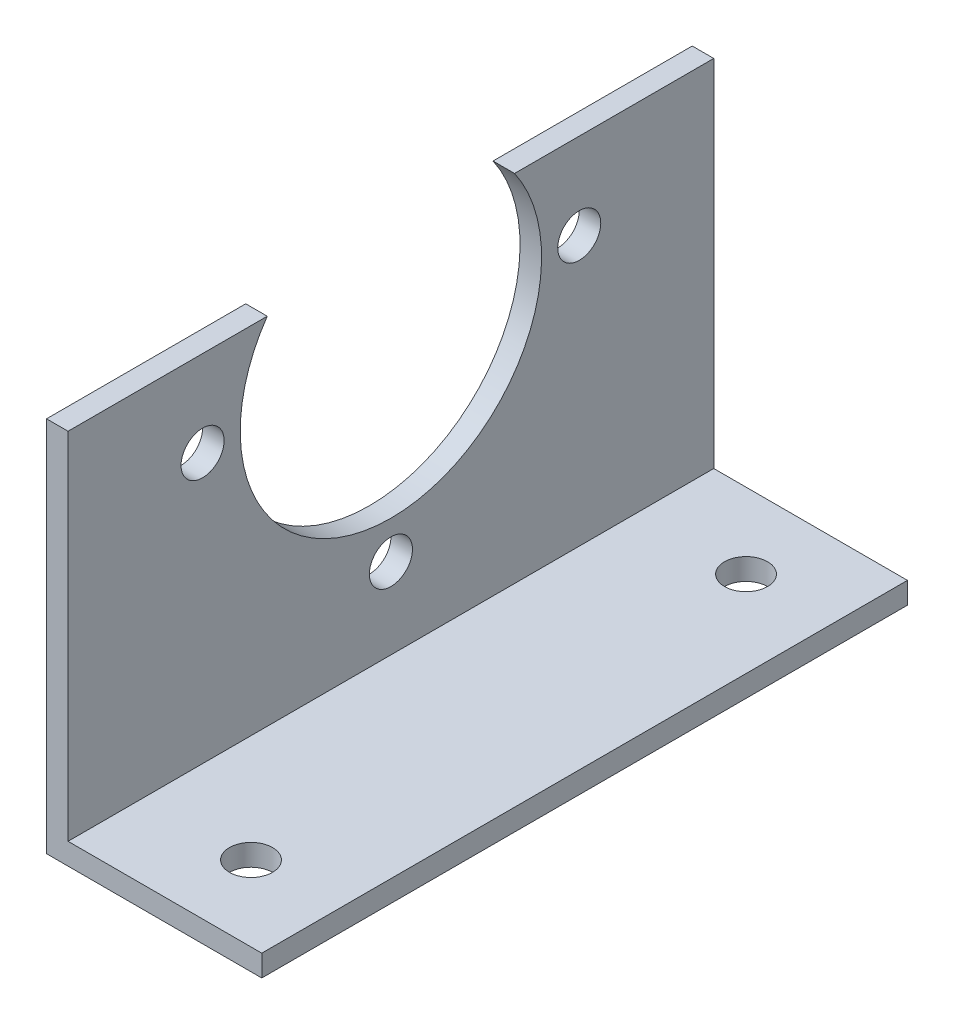
ISO-10303-21;
HEADER;
FILE_DESCRIPTION(('STEP AP214'),'2;1');
FILE_NAME('part.step','',(''),(''),'','','');
FILE_SCHEMA(('AUTOMOTIVE_DESIGN { 1 0 10303 214 1 1 1 1 }'));
ENDSEC;
DATA;
#1=APPLICATION_CONTEXT('core data for automotive mechanical design processes');
#2=APPLICATION_PROTOCOL_DEFINITION('international standard','automotive_design',2000,#1);
#3=PRODUCT_CONTEXT('',#1,'mechanical');
#4=PRODUCT('Part','Part','',(#3));
#5=PRODUCT_RELATED_PRODUCT_CATEGORY('part','',(#4));
#6=PRODUCT_DEFINITION_FORMATION('','',#4);
#7=PRODUCT_DEFINITION_CONTEXT('part definition',#1,'design');
#8=PRODUCT_DEFINITION('design','',#6,#7);
#9=PRODUCT_DEFINITION_SHAPE('','',#8);
#10=(LENGTH_UNIT() NAMED_UNIT(*) SI_UNIT(.MILLI.,.METRE.));
#11=(NAMED_UNIT(*) PLANE_ANGLE_UNIT() SI_UNIT($,.RADIAN.));
#12=(NAMED_UNIT(*) SI_UNIT($,.STERADIAN.) SOLID_ANGLE_UNIT());
#13=UNCERTAINTY_MEASURE_WITH_UNIT(LENGTH_MEASURE(1.E-05),#10,'distance_accuracy_value','');
#14=(GEOMETRIC_REPRESENTATION_CONTEXT(3) GLOBAL_UNCERTAINTY_ASSIGNED_CONTEXT((#13)) GLOBAL_UNIT_ASSIGNED_CONTEXT((#10,
#11,#12)) REPRESENTATION_CONTEXT('',''));
#15=CARTESIAN_POINT('',(0.,0.,0.));
#16=DIRECTION('',(0.,0.,1.));
#17=DIRECTION('',(1.,0.,0.));
#18=AXIS2_PLACEMENT_3D('',#15,#16,#17);
#19=CARTESIAN_POINT('',(0.,35.,-60.));
#20=DIRECTION('',(0.,-1.,0.));
#21=DIRECTION('',(0.,0.,1.));
#22=AXIS2_PLACEMENT_3D('',#19,#20,#21);
#23=PLANE('',#22);
#24=DIRECTION('',(0.,0.,1.));
#25=VECTOR('',#24,1.);
#26=CARTESIAN_POINT('',(2.,35.,-60.));
#27=LINE('',#26,#25);
#28=CARTESIAN_POINT('',(2.,35.,-60.));
#29=VERTEX_POINT('',#28);
#30=CARTESIAN_POINT('',(2.,35.,-41.4891252930761));
#31=VERTEX_POINT('',#30);
#32=EDGE_CURVE('E158',#29,#31,#27,.T.);
#33=ORIENTED_EDGE('',*,*,#32,.F.);
#34=DIRECTION('',(-1.,0.,0.));
#35=VECTOR('',#34,1.);
#36=CARTESIAN_POINT('',(0.,35.,-60.));
#37=LINE('',#36,#35);
#38=CARTESIAN_POINT('',(0.,35.,-60.));
#39=VERTEX_POINT('',#38);
#40=EDGE_CURVE('E137',#29,#39,#37,.T.);
#41=ORIENTED_EDGE('',*,*,#40,.T.);
#42=DIRECTION('',(0.,0.,1.));
#43=VECTOR('',#42,1.);
#44=CARTESIAN_POINT('',(0.,35.,-60.));
#45=LINE('',#44,#43);
#46=CARTESIAN_POINT('',(0.,35.,-41.4891252930761));
#47=VERTEX_POINT('',#46);
#48=EDGE_CURVE('E154',#39,#47,#45,.T.);
#49=ORIENTED_EDGE('',*,*,#48,.T.);
#50=DIRECTION('',(-1.,0.,0.));
#51=VECTOR('',#50,1.);
#52=CARTESIAN_POINT('',(10.,35.,-41.4891252930761));
#53=LINE('',#52,#51);
#54=EDGE_CURVE('E192',#31,#47,#53,.T.);
#55=ORIENTED_EDGE('',*,*,#54,.F.);
#56=EDGE_LOOP('',(#33,#41,#49,#55));
#57=FACE_BOUND('',#56,.T.);
#58=ADVANCED_FACE('F43',(#57),#23,.F.);
#59=CARTESIAN_POINT('',(35.,0.,-60.));
#60=DIRECTION('',(0.,1.,0.));
#61=DIRECTION('',(-1.,0.,0.));
#62=AXIS2_PLACEMENT_3D('',#59,#60,#61);
#63=PLANE('',#62);
#64=CARTESIAN_POINT('',(12.,0.,-53.));
#65=DIRECTION('',(0.,1.,0.));
#66=DIRECTION('',(1.,0.,0.));
#67=AXIS2_PLACEMENT_3D('',#64,#65,#66);
#68=CIRCLE('',#67,2.);
#69=CARTESIAN_POINT('',(14.,0.,-53.));
#70=VERTEX_POINT('',#69);
#71=EDGE_CURVE('E166',#70,#70,#68,.T.);
#72=ORIENTED_EDGE('',*,*,#71,.T.);
#73=EDGE_LOOP('',(#72));
#74=FACE_BOUND('',#73,.T.);
#75=CARTESIAN_POINT('',(12.,0.,-7.));
#76=DIRECTION('',(0.,1.,0.));
#77=DIRECTION('',(1.,0.,0.));
#78=AXIS2_PLACEMENT_3D('',#75,#76,#77);
#79=CIRCLE('',#78,2.);
#80=CARTESIAN_POINT('',(14.,0.,-7.));
#81=VERTEX_POINT('',#80);
#82=EDGE_CURVE('E171',#81,#81,#79,.T.);
#83=ORIENTED_EDGE('',*,*,#82,.T.);
#84=EDGE_LOOP('',(#83));
#85=FACE_BOUND('',#84,.T.);
#86=DIRECTION('',(1.,0.,0.));
#87=VECTOR('',#86,1.);
#88=CARTESIAN_POINT('',(35.,0.,0.));
#89=LINE('',#88,#87);
#90=CARTESIAN_POINT('',(0.,0.,0.));
#91=VERTEX_POINT('',#90);
#92=CARTESIAN_POINT('',(20.,0.,0.));
#93=VERTEX_POINT('',#92);
#94=EDGE_CURVE('E142',#91,#93,#89,.T.);
#95=ORIENTED_EDGE('',*,*,#94,.F.);
#96=DIRECTION('',(0.,0.,1.));
#97=VECTOR('',#96,1.);
#98=CARTESIAN_POINT('',(0.,0.,-60.));
#99=LINE('',#98,#97);
#100=CARTESIAN_POINT('',(0.,0.,-60.));
#101=VERTEX_POINT('',#100);
#102=EDGE_CURVE('E125',#101,#91,#99,.T.);
#103=ORIENTED_EDGE('',*,*,#102,.F.);
#104=DIRECTION('',(1.,0.,0.));
#105=VECTOR('',#104,1.);
#106=CARTESIAN_POINT('',(35.,0.,-60.));
#107=LINE('',#106,#105);
#108=CARTESIAN_POINT('',(20.,0.,-60.));
#109=VERTEX_POINT('',#108);
#110=EDGE_CURVE('E111',#101,#109,#107,.T.);
#111=ORIENTED_EDGE('',*,*,#110,.T.);
#112=DIRECTION('',(0.,0.,1.));
#113=VECTOR('',#112,1.);
#114=CARTESIAN_POINT('',(20.,0.,-60.));
#115=LINE('',#114,#113);
#116=EDGE_CURVE('E117',#109,#93,#115,.T.);
#117=ORIENTED_EDGE('',*,*,#116,.T.);
#118=EDGE_LOOP('',(#95,#103,#111,#117));
#119=FACE_BOUND('',#118,.T.);
#120=ADVANCED_FACE('F45',(#74,#85,#119),#63,.F.);
#121=CARTESIAN_POINT('',(2.,2.,-60.));
#122=DIRECTION('',(0.,-1.,0.));
#123=DIRECTION('',(1.,0.,0.));
#124=AXIS2_PLACEMENT_3D('',#121,#122,#123);
#125=PLANE('',#124);
#126=CARTESIAN_POINT('',(12.,2.,-53.));
#127=DIRECTION('',(0.,1.,0.));
#128=DIRECTION('',(1.,0.,0.));
#129=AXIS2_PLACEMENT_3D('',#126,#127,#128);
#130=CIRCLE('',#129,2.);
#131=CARTESIAN_POINT('',(14.,2.,-53.));
#132=VERTEX_POINT('',#131);
#133=EDGE_CURVE('E47',#132,#132,#130,.T.);
#134=ORIENTED_EDGE('',*,*,#133,.F.);
#135=EDGE_LOOP('',(#134));
#136=FACE_BOUND('',#135,.T.);
#137=CARTESIAN_POINT('',(12.,2.,-7.));
#138=DIRECTION('',(0.,1.,0.));
#139=DIRECTION('',(1.,0.,0.));
#140=AXIS2_PLACEMENT_3D('',#137,#138,#139);
#141=CIRCLE('',#140,2.);
#142=CARTESIAN_POINT('',(14.,2.,-7.));
#143=VERTEX_POINT('',#142);
#144=EDGE_CURVE('E164',#143,#143,#141,.T.);
#145=ORIENTED_EDGE('',*,*,#144,.F.);
#146=EDGE_LOOP('',(#145));
#147=FACE_BOUND('',#146,.T.);
#148=DIRECTION('',(-1.,0.,0.));
#149=VECTOR('',#148,1.);
#150=CARTESIAN_POINT('',(2.,2.,-60.));
#151=LINE('',#150,#149);
#152=CARTESIAN_POINT('',(20.,2.,-60.));
#153=VERTEX_POINT('',#152);
#154=CARTESIAN_POINT('',(2.,2.,-60.));
#155=VERTEX_POINT('',#154);
#156=EDGE_CURVE('E114',#153,#155,#151,.T.);
#157=ORIENTED_EDGE('',*,*,#156,.T.);
#158=DIRECTION('',(0.,0.,1.));
#159=VECTOR('',#158,1.);
#160=CARTESIAN_POINT('',(2.,2.,-60.));
#161=LINE('',#160,#159);
#162=CARTESIAN_POINT('',(2.,2.,0.));
#163=VERTEX_POINT('',#162);
#164=EDGE_CURVE('E161',#155,#163,#161,.T.);
#165=ORIENTED_EDGE('',*,*,#164,.T.);
#166=DIRECTION('',(-1.,0.,0.));
#167=VECTOR('',#166,1.);
#168=CARTESIAN_POINT('',(2.,2.,0.));
#169=LINE('',#168,#167);
#170=CARTESIAN_POINT('',(20.,2.,0.));
#171=VERTEX_POINT('',#170);
#172=EDGE_CURVE('E144',#171,#163,#169,.T.);
#173=ORIENTED_EDGE('',*,*,#172,.F.);
#174=DIRECTION('',(0.,0.,1.));
#175=VECTOR('',#174,1.);
#176=CARTESIAN_POINT('',(20.,2.,-60.));
#177=LINE('',#176,#175);
#178=EDGE_CURVE('E116',#153,#171,#177,.T.);
#179=ORIENTED_EDGE('',*,*,#178,.F.);
#180=EDGE_LOOP('',(#157,#165,#173,#179));
#181=FACE_BOUND('',#180,.T.);
#182=ADVANCED_FACE('F209',(#136,#147,#181),#125,.F.);
#183=CARTESIAN_POINT('',(2.,35.,-60.));
#184=DIRECTION('',(-1.,0.,0.));
#185=DIRECTION('',(0.,-1.,0.));
#186=AXIS2_PLACEMENT_3D('',#183,#184,#185);
#187=PLANE('',#186);
#188=CARTESIAN_POINT('',(2.,27.,-12.5));
#189=DIRECTION('',(1.,0.,0.));
#190=DIRECTION('',(0.,-1.,0.));
#191=AXIS2_PLACEMENT_3D('',#188,#189,#190);
#192=CIRCLE('',#191,2.);
#193=CARTESIAN_POINT('',(2.,25.,-12.5));
#194=VERTEX_POINT('',#193);
#195=EDGE_CURVE('E133',#194,#194,#192,.T.);
#196=ORIENTED_EDGE('',*,*,#195,.F.);
#197=EDGE_LOOP('',(#196));
#198=FACE_BOUND('',#197,.T.);
#199=CARTESIAN_POINT('',(2.,27.,-47.5));
#200=DIRECTION('',(1.,0.,0.));
#201=DIRECTION('',(0.,-1.,0.));
#202=AXIS2_PLACEMENT_3D('',#199,#200,#201);
#203=CIRCLE('',#202,2.);
#204=CARTESIAN_POINT('',(2.,25.,-47.5));
#205=VERTEX_POINT('',#204);
#206=EDGE_CURVE('E196',#205,#205,#203,.T.);
#207=ORIENTED_EDGE('',*,*,#206,.F.);
#208=EDGE_LOOP('',(#207));
#209=FACE_BOUND('',#208,.T.);
#210=CARTESIAN_POINT('',(2.,9.5,-30.));
#211=DIRECTION('',(1.,0.,0.));
#212=DIRECTION('',(0.,-1.,0.));
#213=AXIS2_PLACEMENT_3D('',#210,#211,#212);
#214=CIRCLE('',#213,2.);
#215=CARTESIAN_POINT('',(2.,7.5,-30.));
#216=VERTEX_POINT('',#215);
#217=EDGE_CURVE('E194',#216,#216,#214,.T.);
#218=ORIENTED_EDGE('',*,*,#217,.F.);
#219=EDGE_LOOP('',(#218));
#220=FACE_BOUND('',#219,.T.);
#221=CARTESIAN_POINT('',(2.,35.,-18.5108747069239));
#222=VERTEX_POINT('',#221);
#223=CARTESIAN_POINT('',(2.,35.,0.));
#224=VERTEX_POINT('',#223);
#225=EDGE_CURVE('E157',#222,#224,#27,.T.);
#226=ORIENTED_EDGE('',*,*,#225,.T.);
#227=DIRECTION('',(0.,1.,0.));
#228=VECTOR('',#227,1.);
#229=CARTESIAN_POINT('',(2.,35.,0.));
#230=LINE('',#229,#228);
#231=EDGE_CURVE('E147',#163,#224,#230,.T.);
#232=ORIENTED_EDGE('',*,*,#231,.F.);
#233=ORIENTED_EDGE('',*,*,#164,.F.);
#234=DIRECTION('',(0.,1.,0.));
#235=VECTOR('',#234,1.);
#236=CARTESIAN_POINT('',(2.,35.,-60.));
#237=LINE('',#236,#235);
#238=EDGE_CURVE('E128',#155,#29,#237,.T.);
#239=ORIENTED_EDGE('',*,*,#238,.T.);
#240=ORIENTED_EDGE('',*,*,#32,.T.);
#241=CARTESIAN_POINT('',(2.,27.,-30.));
#242=DIRECTION('',(1.,0.,0.));
#243=DIRECTION('',(0.,-1.,0.));
#244=AXIS2_PLACEMENT_3D('',#241,#242,#243);
#245=CIRCLE('',#244,14.);
#246=EDGE_CURVE('E190',#222,#31,#245,.T.);
#247=ORIENTED_EDGE('',*,*,#246,.F.);
#248=EDGE_LOOP('',(#226,#232,#233,#239,#240,#247));
#249=FACE_BOUND('',#248,.T.);
#250=ADVANCED_FACE('F205',(#198,#209,#220,#249),#187,.F.);
#251=CARTESIAN_POINT('',(0.,35.,-18.5108747069239));
#252=VERTEX_POINT('',#251);
#253=CARTESIAN_POINT('',(0.,35.,0.));
#254=VERTEX_POINT('',#253);
#255=EDGE_CURVE('E153',#252,#254,#45,.T.);
#256=ORIENTED_EDGE('',*,*,#255,.T.);
#257=DIRECTION('',(-1.,0.,0.));
#258=VECTOR('',#257,1.);
#259=CARTESIAN_POINT('',(0.,35.,0.));
#260=LINE('',#259,#258);
#261=EDGE_CURVE('E130',#224,#254,#260,.T.);
#262=ORIENTED_EDGE('',*,*,#261,.F.);
#263=ORIENTED_EDGE('',*,*,#225,.F.);
#264=DIRECTION('',(-1.,0.,0.));
#265=VECTOR('',#264,1.);
#266=CARTESIAN_POINT('',(10.,35.,-18.5108747069239));
#267=LINE('',#266,#265);
#268=EDGE_CURVE('E183',#252,#222,#267,.F.);
#269=ORIENTED_EDGE('',*,*,#268,.F.);
#270=EDGE_LOOP('',(#256,#262,#263,#269));
#271=FACE_BOUND('',#270,.T.);
#272=ADVANCED_FACE('F208',(#271),#23,.F.);
#273=CARTESIAN_POINT('',(0.,0.,-60.));
#274=DIRECTION('',(1.,0.,0.));
#275=DIRECTION('',(0.,0.,1.));
#276=AXIS2_PLACEMENT_3D('',#273,#274,#275);
#277=PLANE('',#276);
#278=CARTESIAN_POINT('',(0.,27.,-12.5));
#279=DIRECTION('',(1.,0.,0.));
#280=DIRECTION('',(0.,0.,-1.));
#281=AXIS2_PLACEMENT_3D('',#278,#279,#280);
#282=CIRCLE('',#281,2.);
#283=CARTESIAN_POINT('',(0.,27.,-14.5));
#284=VERTEX_POINT('',#283);
#285=EDGE_CURVE('E179',#284,#284,#282,.T.);
#286=ORIENTED_EDGE('',*,*,#285,.T.);
#287=EDGE_LOOP('',(#286));
#288=FACE_BOUND('',#287,.T.);
#289=CARTESIAN_POINT('',(0.,27.,-47.5));
#290=DIRECTION('',(1.,0.,0.));
#291=DIRECTION('',(0.,0.,-1.));
#292=AXIS2_PLACEMENT_3D('',#289,#290,#291);
#293=CIRCLE('',#292,2.);
#294=CARTESIAN_POINT('',(0.,27.,-49.5));
#295=VERTEX_POINT('',#294);
#296=EDGE_CURVE('E184',#295,#295,#293,.T.);
#297=ORIENTED_EDGE('',*,*,#296,.T.);
#298=EDGE_LOOP('',(#297));
#299=FACE_BOUND('',#298,.T.);
#300=CARTESIAN_POINT('',(0.,9.5,-30.));
#301=DIRECTION('',(1.,0.,0.));
#302=DIRECTION('',(0.,0.,-1.));
#303=AXIS2_PLACEMENT_3D('',#300,#301,#302);
#304=CIRCLE('',#303,2.);
#305=CARTESIAN_POINT('',(0.,9.5,-32.));
#306=VERTEX_POINT('',#305);
#307=EDGE_CURVE('E180',#306,#306,#304,.T.);
#308=ORIENTED_EDGE('',*,*,#307,.T.);
#309=EDGE_LOOP('',(#308));
#310=FACE_BOUND('',#309,.T.);
#311=ORIENTED_EDGE('',*,*,#48,.F.);
#312=DIRECTION('',(0.,-1.,0.));
#313=VECTOR('',#312,1.);
#314=CARTESIAN_POINT('',(0.,0.,-60.));
#315=LINE('',#314,#313);
#316=EDGE_CURVE('E140',#39,#101,#315,.T.);
#317=ORIENTED_EDGE('',*,*,#316,.T.);
#318=ORIENTED_EDGE('',*,*,#102,.T.);
#319=DIRECTION('',(0.,-1.,0.));
#320=VECTOR('',#319,1.);
#321=CARTESIAN_POINT('',(0.,0.,0.));
#322=LINE('',#321,#320);
#323=EDGE_CURVE('E126',#254,#91,#322,.T.);
#324=ORIENTED_EDGE('',*,*,#323,.F.);
#325=ORIENTED_EDGE('',*,*,#255,.F.);
#326=CARTESIAN_POINT('',(0.,27.,-30.));
#327=DIRECTION('',(-1.,0.,0.));
#328=DIRECTION('',(0.,0.,1.));
#329=AXIS2_PLACEMENT_3D('',#326,#327,#328);
#330=CIRCLE('',#329,14.);
#331=EDGE_CURVE('E52',#47,#252,#330,.T.);
#332=ORIENTED_EDGE('',*,*,#331,.F.);
#333=EDGE_LOOP('',(#311,#317,#318,#324,#325,#332));
#334=FACE_BOUND('',#333,.T.);
#335=ADVANCED_FACE('F251',(#288,#299,#310,#334),#277,.F.);
#336=CARTESIAN_POINT('',(0.,0.,-60.));
#337=DIRECTION('',(0.,0.,1.));
#338=DIRECTION('',(-1.,0.,0.));
#339=AXIS2_PLACEMENT_3D('',#336,#337,#338);
#340=PLANE('',#339);
#341=ORIENTED_EDGE('',*,*,#110,.F.);
#342=ORIENTED_EDGE('',*,*,#316,.F.);
#343=ORIENTED_EDGE('',*,*,#40,.F.);
#344=ORIENTED_EDGE('',*,*,#238,.F.);
#345=ORIENTED_EDGE('',*,*,#156,.F.);
#346=DIRECTION('',(0.,-1.,0.));
#347=VECTOR('',#346,1.);
#348=CARTESIAN_POINT('',(20.,10.,-60.));
#349=LINE('',#348,#347);
#350=EDGE_CURVE('E108',#153,#109,#349,.T.);
#351=ORIENTED_EDGE('',*,*,#350,.T.);
#352=EDGE_LOOP('',(#341,#342,#343,#344,#345,#351));
#353=FACE_BOUND('',#352,.T.);
#354=ADVANCED_FACE('F109',(#353),#340,.F.);
#355=CARTESIAN_POINT('',(0.,0.,0.));
#356=DIRECTION('',(0.,0.,1.));
#357=DIRECTION('',(-1.,0.,0.));
#358=AXIS2_PLACEMENT_3D('',#355,#356,#357);
#359=PLANE('',#358);
#360=DIRECTION('',(0.,1.,0.));
#361=VECTOR('',#360,1.);
#362=CARTESIAN_POINT('',(20.,0.,0.));
#363=LINE('',#362,#361);
#364=EDGE_CURVE('E11',#93,#171,#363,.T.);
#365=ORIENTED_EDGE('',*,*,#364,.T.);
#366=ORIENTED_EDGE('',*,*,#172,.T.);
#367=ORIENTED_EDGE('',*,*,#231,.T.);
#368=ORIENTED_EDGE('',*,*,#261,.T.);
#369=ORIENTED_EDGE('',*,*,#323,.T.);
#370=ORIENTED_EDGE('',*,*,#94,.T.);
#371=EDGE_LOOP('',(#365,#366,#367,#368,#369,#370));
#372=FACE_BOUND('',#371,.T.);
#373=ADVANCED_FACE('F222',(#372),#359,.T.);
#374=CARTESIAN_POINT('',(10.,27.,-30.));
#375=DIRECTION('',(-1.,0.,0.));
#376=DIRECTION('',(0.,0.,-1.));
#377=AXIS2_PLACEMENT_3D('',#374,#375,#376);
#378=CYLINDRICAL_SURFACE('',#377,14.);
#379=ORIENTED_EDGE('',*,*,#246,.T.);
#380=ORIENTED_EDGE('',*,*,#54,.T.);
#381=ORIENTED_EDGE('',*,*,#331,.T.);
#382=ORIENTED_EDGE('',*,*,#268,.T.);
#383=EDGE_LOOP('',(#379,#380,#381,#382));
#384=FACE_BOUND('',#383,.T.);
#385=ADVANCED_FACE('F230',(#384),#378,.F.);
#386=CARTESIAN_POINT('',(10.,9.5,-30.));
#387=DIRECTION('',(-1.,0.,0.));
#388=DIRECTION('',(0.,0.,-1.));
#389=AXIS2_PLACEMENT_3D('',#386,#387,#388);
#390=CYLINDRICAL_SURFACE('',#389,2.);
#391=ORIENTED_EDGE('',*,*,#307,.F.);
#392=EDGE_LOOP('',(#391));
#393=FACE_BOUND('',#392,.T.);
#394=ORIENTED_EDGE('',*,*,#217,.T.);
#395=EDGE_LOOP('',(#394));
#396=FACE_BOUND('',#395,.T.);
#397=ADVANCED_FACE('F232',(#393,#396),#390,.F.);
#398=CARTESIAN_POINT('',(10.,27.,-47.5));
#399=DIRECTION('',(-1.,0.,0.));
#400=DIRECTION('',(0.,0.,-1.));
#401=AXIS2_PLACEMENT_3D('',#398,#399,#400);
#402=CYLINDRICAL_SURFACE('',#401,2.);
#403=ORIENTED_EDGE('',*,*,#296,.F.);
#404=EDGE_LOOP('',(#403));
#405=FACE_BOUND('',#404,.T.);
#406=ORIENTED_EDGE('',*,*,#206,.T.);
#407=EDGE_LOOP('',(#406));
#408=FACE_BOUND('',#407,.T.);
#409=ADVANCED_FACE('F238',(#405,#408),#402,.F.);
#410=CARTESIAN_POINT('',(10.,27.,-12.5));
#411=DIRECTION('',(-1.,0.,0.));
#412=DIRECTION('',(0.,0.,-1.));
#413=AXIS2_PLACEMENT_3D('',#410,#411,#412);
#414=CYLINDRICAL_SURFACE('',#413,2.);
#415=ORIENTED_EDGE('',*,*,#285,.F.);
#416=EDGE_LOOP('',(#415));
#417=FACE_BOUND('',#416,.T.);
#418=ORIENTED_EDGE('',*,*,#195,.T.);
#419=EDGE_LOOP('',(#418));
#420=FACE_BOUND('',#419,.T.);
#421=ADVANCED_FACE('F203',(#417,#420),#414,.F.);
#422=CARTESIAN_POINT('',(20.,10.,-60.));
#423=DIRECTION('',(-1.,0.,0.));
#424=DIRECTION('',(0.,0.,-1.));
#425=AXIS2_PLACEMENT_3D('',#422,#423,#424);
#426=PLANE('',#425);
#427=ORIENTED_EDGE('',*,*,#350,.F.);
#428=ORIENTED_EDGE('',*,*,#178,.T.);
#429=ORIENTED_EDGE('',*,*,#364,.F.);
#430=ORIENTED_EDGE('',*,*,#116,.F.);
#431=EDGE_LOOP('',(#427,#428,#429,#430));
#432=FACE_BOUND('',#431,.T.);
#433=ADVANCED_FACE('F119',(#432),#426,.F.);
#434=CARTESIAN_POINT('',(12.,10.,-7.));
#435=DIRECTION('',(0.,-1.,0.));
#436=DIRECTION('',(1.,0.,0.));
#437=AXIS2_PLACEMENT_3D('',#434,#435,#436);
#438=CYLINDRICAL_SURFACE('',#437,2.);
#439=ORIENTED_EDGE('',*,*,#82,.F.);
#440=EDGE_LOOP('',(#439));
#441=FACE_BOUND('',#440,.T.);
#442=ORIENTED_EDGE('',*,*,#144,.T.);
#443=EDGE_LOOP('',(#442));
#444=FACE_BOUND('',#443,.T.);
#445=ADVANCED_FACE('F276',(#441,#444),#438,.F.);
#446=CARTESIAN_POINT('',(12.,10.,-53.));
#447=DIRECTION('',(0.,-1.,0.));
#448=DIRECTION('',(1.,0.,0.));
#449=AXIS2_PLACEMENT_3D('',#446,#447,#448);
#450=CYLINDRICAL_SURFACE('',#449,2.);
#451=ORIENTED_EDGE('',*,*,#71,.F.);
#452=EDGE_LOOP('',(#451));
#453=FACE_BOUND('',#452,.T.);
#454=ORIENTED_EDGE('',*,*,#133,.T.);
#455=EDGE_LOOP('',(#454));
#456=FACE_BOUND('',#455,.T.);
#457=ADVANCED_FACE('F279',(#453,#456),#450,.F.);
#458=CLOSED_SHELL('',(#58,#120,#182,#250,#272,#335,#354,#373,#385,#397,#409,#421,#433,#445,#457));
#459=MANIFOLD_SOLID_BREP('B2',#458);
#460=ADVANCED_BREP_SHAPE_REPRESENTATION('',(#18,#459),#14);
#461=SHAPE_DEFINITION_REPRESENTATION(#9,#460);
ENDSEC;
END-ISO-10303-21;
